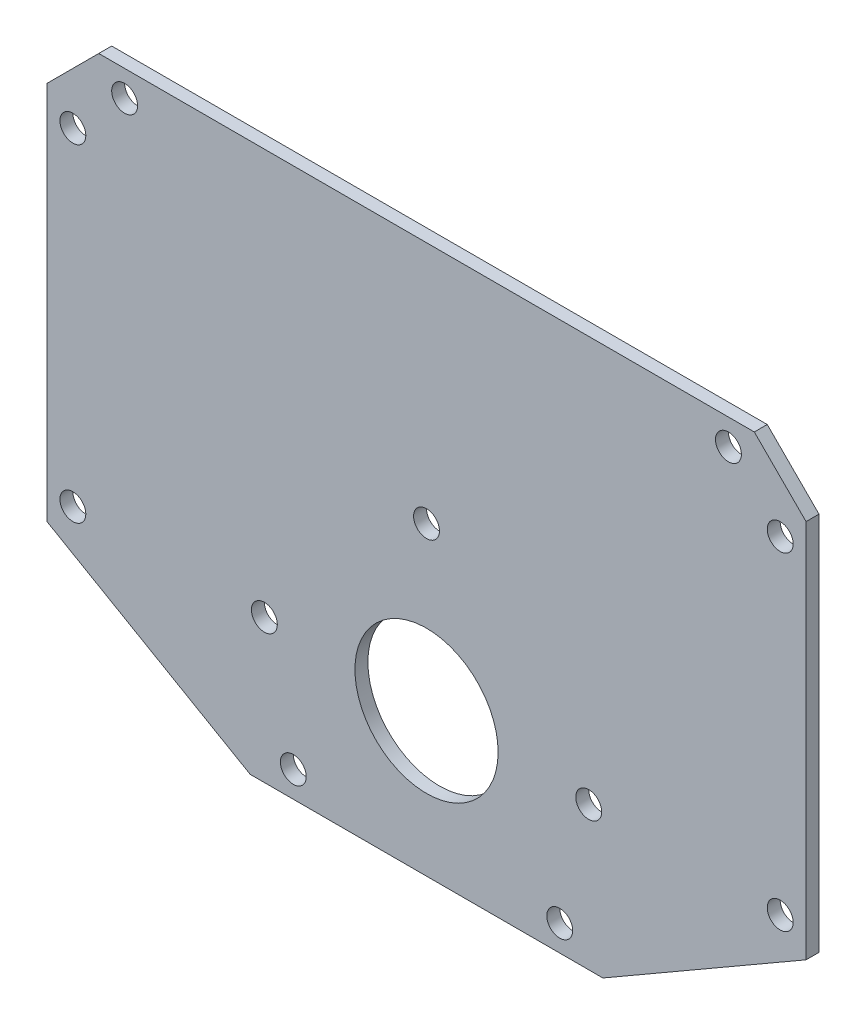
ISO-10303-21;
HEADER;
FILE_DESCRIPTION(('STEP AP214'),'2;1');
FILE_NAME('part.step','',(''),(''),'','','');
FILE_SCHEMA(('AUTOMOTIVE_DESIGN { 1 0 10303 214 1 1 1 1 }'));
ENDSEC;
DATA;
#1=APPLICATION_CONTEXT('core data for automotive mechanical design processes');
#2=APPLICATION_PROTOCOL_DEFINITION('international standard','automotive_design',2000,#1);
#3=PRODUCT_CONTEXT('',#1,'mechanical');
#4=PRODUCT('Part','Part','',(#3));
#5=PRODUCT_RELATED_PRODUCT_CATEGORY('part','',(#4));
#6=PRODUCT_DEFINITION_FORMATION('','',#4);
#7=PRODUCT_DEFINITION_CONTEXT('part definition',#1,'design');
#8=PRODUCT_DEFINITION('design','',#6,#7);
#9=PRODUCT_DEFINITION_SHAPE('','',#8);
#10=(LENGTH_UNIT() NAMED_UNIT(*) SI_UNIT(.MILLI.,.METRE.));
#11=(NAMED_UNIT(*) PLANE_ANGLE_UNIT() SI_UNIT($,.RADIAN.));
#12=(NAMED_UNIT(*) SI_UNIT($,.STERADIAN.) SOLID_ANGLE_UNIT());
#13=UNCERTAINTY_MEASURE_WITH_UNIT(LENGTH_MEASURE(1.E-05),#10,'distance_accuracy_value','');
#14=(GEOMETRIC_REPRESENTATION_CONTEXT(3) GLOBAL_UNCERTAINTY_ASSIGNED_CONTEXT((#13)) GLOBAL_UNIT_ASSIGNED_CONTEXT((#10,
#11,#12)) REPRESENTATION_CONTEXT('',''));
#15=CARTESIAN_POINT('',(0.,0.,0.));
#16=DIRECTION('',(0.,0.,1.));
#17=DIRECTION('',(1.,0.,0.));
#18=AXIS2_PLACEMENT_3D('',#15,#16,#17);
#19=CARTESIAN_POINT('',(0.,0.,1.5));
#20=DIRECTION('',(0.,0.,-1.));
#21=DIRECTION('',(-1.,0.,0.));
#22=AXIS2_PLACEMENT_3D('',#19,#20,#21);
#23=PLANE('',#22);
#24=CARTESIAN_POINT('',(-15.4441090170633,-32.6,1.5));
#25=DIRECTION('',(0.,0.,1.));
#26=DIRECTION('',(1.,0.,0.));
#27=AXIS2_PLACEMENT_3D('',#24,#25,#26);
#28=CIRCLE('',#27,1.5);
#29=CARTESIAN_POINT('',(-13.9441090170633,-32.6,1.5));
#30=VERTEX_POINT('',#29);
#31=EDGE_CURVE('E312',#30,#30,#28,.T.);
#32=ORIENTED_EDGE('',*,*,#31,.F.);
#33=EDGE_LOOP('',(#32));
#34=FACE_BOUND('',#33,.T.);
#35=CARTESIAN_POINT('',(0.,-19.,1.5));
#36=DIRECTION('',(0.,0.,1.));
#37=DIRECTION('',(1.,0.,0.));
#38=AXIS2_PLACEMENT_3D('',#35,#36,#37);
#39=CIRCLE('',#38,8.3);
#40=CARTESIAN_POINT('',(8.3,-19.,1.5));
#41=VERTEX_POINT('',#40);
#42=EDGE_CURVE('E316',#41,#41,#39,.T.);
#43=ORIENTED_EDGE('',*,*,#42,.F.);
#44=EDGE_LOOP('',(#43));
#45=FACE_BOUND('',#44,.T.);
#46=CARTESIAN_POINT('',(18.8,-19.,1.5));
#47=DIRECTION('',(0.,0.,1.));
#48=DIRECTION('',(1.,0.,0.));
#49=AXIS2_PLACEMENT_3D('',#46,#47,#48);
#50=CIRCLE('',#49,1.5);
#51=CARTESIAN_POINT('',(20.3,-19.,1.5));
#52=VERTEX_POINT('',#51);
#53=EDGE_CURVE('E325',#52,#52,#50,.T.);
#54=ORIENTED_EDGE('',*,*,#53,.F.);
#55=EDGE_LOOP('',(#54));
#56=FACE_BOUND('',#55,.T.);
#57=CARTESIAN_POINT('',(-18.8,-19.,1.5));
#58=DIRECTION('',(0.,0.,1.));
#59=DIRECTION('',(1.,0.,0.));
#60=AXIS2_PLACEMENT_3D('',#57,#58,#59);
#61=CIRCLE('',#60,1.5);
#62=CARTESIAN_POINT('',(-17.3,-19.,1.5));
#63=VERTEX_POINT('',#62);
#64=EDGE_CURVE('E327',#63,#63,#61,.T.);
#65=ORIENTED_EDGE('',*,*,#64,.F.);
#66=EDGE_LOOP('',(#65));
#67=FACE_BOUND('',#66,.T.);
#68=CARTESIAN_POINT('',(15.4441090170629,-32.6,1.5));
#69=DIRECTION('',(0.,0.,1.));
#70=DIRECTION('',(1.,0.,0.));
#71=AXIS2_PLACEMENT_3D('',#68,#69,#70);
#72=CIRCLE('',#71,1.5);
#73=CARTESIAN_POINT('',(16.9441090170629,-32.6,1.5));
#74=VERTEX_POINT('',#73);
#75=EDGE_CURVE('E310',#74,#74,#72,.T.);
#76=ORIENTED_EDGE('',*,*,#75,.F.);
#77=EDGE_LOOP('',(#76));
#78=FACE_BOUND('',#77,.T.);
#79=CARTESIAN_POINT('',(34.9999999999999,25.,1.5));
#80=DIRECTION('',(0.,0.,1.));
#81=DIRECTION('',(1.,0.,0.));
#82=AXIS2_PLACEMENT_3D('',#79,#80,#81);
#83=CIRCLE('',#82,1.5);
#84=CARTESIAN_POINT('',(36.4999999999999,25.,1.5));
#85=VERTEX_POINT('',#84);
#86=EDGE_CURVE('E313',#85,#85,#83,.T.);
#87=ORIENTED_EDGE('',*,*,#86,.F.);
#88=EDGE_LOOP('',(#87));
#89=FACE_BOUND('',#88,.T.);
#90=CARTESIAN_POINT('',(-35.,25.,1.5));
#91=DIRECTION('',(0.,0.,1.));
#92=DIRECTION('',(1.,0.,0.));
#93=AXIS2_PLACEMENT_3D('',#90,#91,#92);
#94=CIRCLE('',#93,1.5);
#95=CARTESIAN_POINT('',(-33.5,25.,1.5));
#96=VERTEX_POINT('',#95);
#97=EDGE_CURVE('E319',#96,#96,#94,.T.);
#98=ORIENTED_EDGE('',*,*,#97,.F.);
#99=EDGE_LOOP('',(#98));
#100=FACE_BOUND('',#99,.T.);
#101=CARTESIAN_POINT('',(0.,-0.20000000000003,1.5));
#102=DIRECTION('',(0.,0.,1.));
#103=DIRECTION('',(1.,0.,0.));
#104=AXIS2_PLACEMENT_3D('',#101,#102,#103);
#105=CIRCLE('',#104,1.5);
#106=CARTESIAN_POINT('',(1.5,-0.20000000000003,1.5));
#107=VERTEX_POINT('',#106);
#108=EDGE_CURVE('E170',#107,#107,#105,.T.);
#109=ORIENTED_EDGE('',*,*,#108,.F.);
#110=EDGE_LOOP('',(#109));
#111=FACE_BOUND('',#110,.T.);
#112=DIRECTION('',(0.866025403784442,0.499999999999995,0.));
#113=VECTOR('',#112,1.);
#114=CARTESIAN_POINT('',(44.,-22.,1.5));
#115=LINE('',#114,#113);
#116=CARTESIAN_POINT('',(20.4441090170629,-35.6,1.5));
#117=VERTEX_POINT('',#116);
#118=CARTESIAN_POINT('',(44.,-22.,1.5));
#119=VERTEX_POINT('',#118);
#120=EDGE_CURVE('E154',#117,#119,#115,.T.);
#121=ORIENTED_EDGE('',*,*,#120,.T.);
#122=DIRECTION('',(0.,1.,0.));
#123=VECTOR('',#122,1.);
#124=CARTESIAN_POINT('',(44.,22.,1.5));
#125=LINE('',#124,#123);
#126=CARTESIAN_POINT('',(44.,22.,1.5));
#127=VERTEX_POINT('',#126);
#128=EDGE_CURVE('E102',#119,#127,#125,.T.);
#129=ORIENTED_EDGE('',*,*,#128,.T.);
#130=DIRECTION('',(-0.707106781186552,0.707106781186543,0.));
#131=VECTOR('',#130,1.);
#132=CARTESIAN_POINT('',(44.,22.,1.5));
#133=LINE('',#132,#131);
#134=CARTESIAN_POINT('',(37.9999999999999,28.,1.5));
#135=VERTEX_POINT('',#134);
#136=EDGE_CURVE('E220',#127,#135,#133,.T.);
#137=ORIENTED_EDGE('',*,*,#136,.T.);
#138=DIRECTION('',(-1.,0.,0.));
#139=VECTOR('',#138,1.);
#140=CARTESIAN_POINT('',(-38.,28.,1.5));
#141=LINE('',#140,#139);
#142=CARTESIAN_POINT('',(-38.,28.,1.5));
#143=VERTEX_POINT('',#142);
#144=EDGE_CURVE('E222',#135,#143,#141,.T.);
#145=ORIENTED_EDGE('',*,*,#144,.T.);
#146=DIRECTION('',(-0.707106781186546,-0.707106781186549,0.));
#147=VECTOR('',#146,1.);
#148=CARTESIAN_POINT('',(-44.,22.,1.5));
#149=LINE('',#148,#147);
#150=CARTESIAN_POINT('',(-44.,22.,1.5));
#151=VERTEX_POINT('',#150);
#152=EDGE_CURVE('E121',#143,#151,#149,.T.);
#153=ORIENTED_EDGE('',*,*,#152,.T.);
#154=DIRECTION('',(0.,-1.,0.));
#155=VECTOR('',#154,1.);
#156=CARTESIAN_POINT('',(-44.,22.,1.5));
#157=LINE('',#156,#155);
#158=CARTESIAN_POINT('',(-44.,-22.,1.5));
#159=VERTEX_POINT('',#158);
#160=EDGE_CURVE('E115',#151,#159,#157,.T.);
#161=ORIENTED_EDGE('',*,*,#160,.T.);
#162=DIRECTION('',(0.866025403784438,-0.500000000000001,0.));
#163=VECTOR('',#162,1.);
#164=CARTESIAN_POINT('',(-44.,-22.,1.5));
#165=LINE('',#164,#163);
#166=CARTESIAN_POINT('',(-20.4441090170633,-35.6,1.5));
#167=VERTEX_POINT('',#166);
#168=EDGE_CURVE('E119',#159,#167,#165,.T.);
#169=ORIENTED_EDGE('',*,*,#168,.T.);
#170=DIRECTION('',(1.,0.,0.));
#171=VECTOR('',#170,1.);
#172=CARTESIAN_POINT('',(-20.4441090170633,-35.6,1.5));
#173=LINE('',#172,#171);
#174=EDGE_CURVE('E59',#167,#117,#173,.T.);
#175=ORIENTED_EDGE('',*,*,#174,.T.);
#176=EDGE_LOOP('',(#121,#129,#137,#145,#153,#161,#169,#175));
#177=FACE_BOUND('',#176,.T.);
#178=CARTESIAN_POINT('',(-41.,19.,1.5));
#179=DIRECTION('',(0.,0.,1.));
#180=DIRECTION('',(1.,0.,0.));
#181=AXIS2_PLACEMENT_3D('',#178,#179,#180);
#182=CIRCLE('',#181,1.5);
#183=CARTESIAN_POINT('',(-39.5,19.,1.5));
#184=VERTEX_POINT('',#183);
#185=EDGE_CURVE('E143',#184,#184,#182,.T.);
#186=ORIENTED_EDGE('',*,*,#185,.F.);
#187=EDGE_LOOP('',(#186));
#188=FACE_BOUND('',#187,.T.);
#189=CARTESIAN_POINT('',(-41.,-19.,1.5));
#190=DIRECTION('',(0.,0.,1.));
#191=DIRECTION('',(1.,0.,0.));
#192=AXIS2_PLACEMENT_3D('',#189,#190,#191);
#193=CIRCLE('',#192,1.5);
#194=CARTESIAN_POINT('',(-39.5,-19.,1.5));
#195=VERTEX_POINT('',#194);
#196=EDGE_CURVE('E208',#195,#195,#193,.T.);
#197=ORIENTED_EDGE('',*,*,#196,.F.);
#198=EDGE_LOOP('',(#197));
#199=FACE_BOUND('',#198,.T.);
#200=CARTESIAN_POINT('',(41.,19.,1.5));
#201=DIRECTION('',(0.,0.,1.));
#202=DIRECTION('',(1.,0.,0.));
#203=AXIS2_PLACEMENT_3D('',#200,#201,#202);
#204=CIRCLE('',#203,1.5);
#205=CARTESIAN_POINT('',(42.5,19.,1.5));
#206=VERTEX_POINT('',#205);
#207=EDGE_CURVE('E202',#206,#206,#204,.T.);
#208=ORIENTED_EDGE('',*,*,#207,.F.);
#209=EDGE_LOOP('',(#208));
#210=FACE_BOUND('',#209,.T.);
#211=CARTESIAN_POINT('',(41.,-19.,1.5));
#212=DIRECTION('',(0.,0.,1.));
#213=DIRECTION('',(1.,0.,0.));
#214=AXIS2_PLACEMENT_3D('',#211,#212,#213);
#215=CIRCLE('',#214,1.49999999999999);
#216=CARTESIAN_POINT('',(42.5,-19.,1.5));
#217=VERTEX_POINT('',#216);
#218=EDGE_CURVE('E193',#217,#217,#215,.T.);
#219=ORIENTED_EDGE('',*,*,#218,.F.);
#220=EDGE_LOOP('',(#219));
#221=FACE_BOUND('',#220,.T.);
#222=ADVANCED_FACE('F40',(#34,#45,#56,#67,#78,#89,#100,#111,#177,#188,#199,#210,#221),#23,.F.);
#223=CARTESIAN_POINT('',(0.,0.,0.));
#224=DIRECTION('',(0.,0.,-1.));
#225=DIRECTION('',(-1.,0.,0.));
#226=AXIS2_PLACEMENT_3D('',#223,#224,#225);
#227=PLANE('',#226);
#228=CARTESIAN_POINT('',(-15.4441090170633,-32.6,0.));
#229=DIRECTION('',(0.,0.,-1.));
#230=DIRECTION('',(-1.,0.,0.));
#231=AXIS2_PLACEMENT_3D('',#228,#229,#230);
#232=CIRCLE('',#231,1.5);
#233=CARTESIAN_POINT('',(-16.9441090170633,-32.6,0.));
#234=VERTEX_POINT('',#233);
#235=EDGE_CURVE('E44',#234,#234,#232,.T.);
#236=ORIENTED_EDGE('',*,*,#235,.F.);
#237=EDGE_LOOP('',(#236));
#238=FACE_BOUND('',#237,.T.);
#239=CARTESIAN_POINT('',(0.,-19.,0.));
#240=DIRECTION('',(0.,0.,-1.));
#241=DIRECTION('',(-1.,0.,0.));
#242=AXIS2_PLACEMENT_3D('',#239,#240,#241);
#243=CIRCLE('',#242,8.3);
#244=CARTESIAN_POINT('',(-8.3,-19.,0.));
#245=VERTEX_POINT('',#244);
#246=EDGE_CURVE('E184',#245,#245,#243,.T.);
#247=ORIENTED_EDGE('',*,*,#246,.F.);
#248=EDGE_LOOP('',(#247));
#249=FACE_BOUND('',#248,.T.);
#250=CARTESIAN_POINT('',(18.8,-19.,0.));
#251=DIRECTION('',(0.,0.,-1.));
#252=DIRECTION('',(-1.,0.,0.));
#253=AXIS2_PLACEMENT_3D('',#250,#251,#252);
#254=CIRCLE('',#253,1.5);
#255=CARTESIAN_POINT('',(17.3,-19.,0.));
#256=VERTEX_POINT('',#255);
#257=EDGE_CURVE('E182',#256,#256,#254,.T.);
#258=ORIENTED_EDGE('',*,*,#257,.F.);
#259=EDGE_LOOP('',(#258));
#260=FACE_BOUND('',#259,.T.);
#261=CARTESIAN_POINT('',(-18.8,-19.,0.));
#262=DIRECTION('',(0.,0.,-1.));
#263=DIRECTION('',(-1.,0.,0.));
#264=AXIS2_PLACEMENT_3D('',#261,#262,#263);
#265=CIRCLE('',#264,1.5);
#266=CARTESIAN_POINT('',(-20.3,-19.,0.));
#267=VERTEX_POINT('',#266);
#268=EDGE_CURVE('E179',#267,#267,#265,.T.);
#269=ORIENTED_EDGE('',*,*,#268,.F.);
#270=EDGE_LOOP('',(#269));
#271=FACE_BOUND('',#270,.T.);
#272=CARTESIAN_POINT('',(15.4441090170629,-32.6,0.));
#273=DIRECTION('',(0.,0.,-1.));
#274=DIRECTION('',(-1.,0.,0.));
#275=AXIS2_PLACEMENT_3D('',#272,#273,#274);
#276=CIRCLE('',#275,1.5);
#277=CARTESIAN_POINT('',(13.9441090170629,-32.6,0.));
#278=VERTEX_POINT('',#277);
#279=EDGE_CURVE('E176',#278,#278,#276,.T.);
#280=ORIENTED_EDGE('',*,*,#279,.F.);
#281=EDGE_LOOP('',(#280));
#282=FACE_BOUND('',#281,.T.);
#283=CARTESIAN_POINT('',(34.9999999999999,25.,0.));
#284=DIRECTION('',(0.,0.,-1.));
#285=DIRECTION('',(-1.,0.,0.));
#286=AXIS2_PLACEMENT_3D('',#283,#284,#285);
#287=CIRCLE('',#286,1.5);
#288=CARTESIAN_POINT('',(33.4999999999999,25.,0.));
#289=VERTEX_POINT('',#288);
#290=EDGE_CURVE('E173',#289,#289,#287,.T.);
#291=ORIENTED_EDGE('',*,*,#290,.F.);
#292=EDGE_LOOP('',(#291));
#293=FACE_BOUND('',#292,.T.);
#294=CARTESIAN_POINT('',(-35.,25.,0.));
#295=DIRECTION('',(0.,0.,-1.));
#296=DIRECTION('',(-1.,0.,0.));
#297=AXIS2_PLACEMENT_3D('',#294,#295,#296);
#298=CIRCLE('',#297,1.5);
#299=CARTESIAN_POINT('',(-36.5,25.,0.));
#300=VERTEX_POINT('',#299);
#301=EDGE_CURVE('E169',#300,#300,#298,.T.);
#302=ORIENTED_EDGE('',*,*,#301,.F.);
#303=EDGE_LOOP('',(#302));
#304=FACE_BOUND('',#303,.T.);
#305=CARTESIAN_POINT('',(0.,-0.20000000000003,0.));
#306=DIRECTION('',(0.,0.,-1.));
#307=DIRECTION('',(-1.,0.,0.));
#308=AXIS2_PLACEMENT_3D('',#305,#306,#307);
#309=CIRCLE('',#308,1.5);
#310=CARTESIAN_POINT('',(-1.5,-0.20000000000003,0.));
#311=VERTEX_POINT('',#310);
#312=EDGE_CURVE('E166',#311,#311,#309,.T.);
#313=ORIENTED_EDGE('',*,*,#312,.F.);
#314=EDGE_LOOP('',(#313));
#315=FACE_BOUND('',#314,.T.);
#316=CARTESIAN_POINT('',(41.,19.,0.));
#317=DIRECTION('',(0.,0.,1.));
#318=DIRECTION('',(1.,0.,0.));
#319=AXIS2_PLACEMENT_3D('',#316,#317,#318);
#320=CIRCLE('',#319,1.5);
#321=CARTESIAN_POINT('',(42.5,19.,0.));
#322=VERTEX_POINT('',#321);
#323=EDGE_CURVE('E198',#322,#322,#320,.T.);
#324=ORIENTED_EDGE('',*,*,#323,.T.);
#325=EDGE_LOOP('',(#324));
#326=FACE_BOUND('',#325,.T.);
#327=CARTESIAN_POINT('',(-41.,19.,0.));
#328=DIRECTION('',(0.,0.,1.));
#329=DIRECTION('',(1.,0.,0.));
#330=AXIS2_PLACEMENT_3D('',#327,#328,#329);
#331=CIRCLE('',#330,1.5);
#332=CARTESIAN_POINT('',(-39.5,19.,0.));
#333=VERTEX_POINT('',#332);
#334=EDGE_CURVE('E211',#333,#333,#331,.T.);
#335=ORIENTED_EDGE('',*,*,#334,.T.);
#336=EDGE_LOOP('',(#335));
#337=FACE_BOUND('',#336,.T.);
#338=DIRECTION('',(0.866025403784442,0.499999999999995,0.));
#339=VECTOR('',#338,1.);
#340=CARTESIAN_POINT('',(44.,-22.,0.));
#341=LINE('',#340,#339);
#342=CARTESIAN_POINT('',(20.4441090170629,-35.6,0.));
#343=VERTEX_POINT('',#342);
#344=CARTESIAN_POINT('',(44.,-22.,0.));
#345=VERTEX_POINT('',#344);
#346=EDGE_CURVE('E139',#343,#345,#341,.T.);
#347=ORIENTED_EDGE('',*,*,#346,.F.);
#348=DIRECTION('',(1.,0.,0.));
#349=VECTOR('',#348,1.);
#350=CARTESIAN_POINT('',(-20.4441090170633,-35.6,0.));
#351=LINE('',#350,#349);
#352=CARTESIAN_POINT('',(-20.4441090170633,-35.6,0.));
#353=VERTEX_POINT('',#352);
#354=EDGE_CURVE('E94',#353,#343,#351,.T.);
#355=ORIENTED_EDGE('',*,*,#354,.F.);
#356=DIRECTION('',(0.866025403784438,-0.500000000000001,0.));
#357=VECTOR('',#356,1.);
#358=CARTESIAN_POINT('',(-44.,-22.,0.));
#359=LINE('',#358,#357);
#360=CARTESIAN_POINT('',(-44.,-22.,0.));
#361=VERTEX_POINT('',#360);
#362=EDGE_CURVE('E88',#361,#353,#359,.T.);
#363=ORIENTED_EDGE('',*,*,#362,.F.);
#364=DIRECTION('',(0.,-1.,0.));
#365=VECTOR('',#364,1.);
#366=CARTESIAN_POINT('',(-44.,22.,0.));
#367=LINE('',#366,#365);
#368=CARTESIAN_POINT('',(-44.,22.,0.));
#369=VERTEX_POINT('',#368);
#370=EDGE_CURVE('E129',#369,#361,#367,.T.);
#371=ORIENTED_EDGE('',*,*,#370,.F.);
#372=DIRECTION('',(-0.707106781186546,-0.707106781186549,0.));
#373=VECTOR('',#372,1.);
#374=CARTESIAN_POINT('',(-44.,22.,0.));
#375=LINE('',#374,#373);
#376=CARTESIAN_POINT('',(-38.,28.,0.));
#377=VERTEX_POINT('',#376);
#378=EDGE_CURVE('E149',#377,#369,#375,.T.);
#379=ORIENTED_EDGE('',*,*,#378,.F.);
#380=DIRECTION('',(-1.,0.,0.));
#381=VECTOR('',#380,1.);
#382=CARTESIAN_POINT('',(-38.,28.,0.));
#383=LINE('',#382,#381);
#384=CARTESIAN_POINT('',(37.9999999999999,28.,0.));
#385=VERTEX_POINT('',#384);
#386=EDGE_CURVE('E147',#385,#377,#383,.T.);
#387=ORIENTED_EDGE('',*,*,#386,.F.);
#388=DIRECTION('',(-0.707106781186552,0.707106781186543,0.));
#389=VECTOR('',#388,1.);
#390=CARTESIAN_POINT('',(44.,22.,0.));
#391=LINE('',#390,#389);
#392=CARTESIAN_POINT('',(44.,22.,0.));
#393=VERTEX_POINT('',#392);
#394=EDGE_CURVE('E145',#393,#385,#391,.T.);
#395=ORIENTED_EDGE('',*,*,#394,.F.);
#396=DIRECTION('',(0.,1.,0.));
#397=VECTOR('',#396,1.);
#398=CARTESIAN_POINT('',(44.,22.,0.));
#399=LINE('',#398,#397);
#400=EDGE_CURVE('E142',#345,#393,#399,.T.);
#401=ORIENTED_EDGE('',*,*,#400,.F.);
#402=EDGE_LOOP('',(#347,#355,#363,#371,#379,#387,#395,#401));
#403=FACE_BOUND('',#402,.T.);
#404=CARTESIAN_POINT('',(-41.,-19.,0.));
#405=DIRECTION('',(0.,0.,1.));
#406=DIRECTION('',(1.,0.,0.));
#407=AXIS2_PLACEMENT_3D('',#404,#405,#406);
#408=CIRCLE('',#407,1.5);
#409=CARTESIAN_POINT('',(-39.5,-19.,0.));
#410=VERTEX_POINT('',#409);
#411=EDGE_CURVE('E205',#410,#410,#408,.T.);
#412=ORIENTED_EDGE('',*,*,#411,.T.);
#413=EDGE_LOOP('',(#412));
#414=FACE_BOUND('',#413,.T.);
#415=CARTESIAN_POINT('',(41.,-19.,0.));
#416=DIRECTION('',(0.,0.,1.));
#417=DIRECTION('',(1.,0.,0.));
#418=AXIS2_PLACEMENT_3D('',#415,#416,#417);
#419=CIRCLE('',#418,1.49999999999999);
#420=CARTESIAN_POINT('',(42.5,-19.,0.));
#421=VERTEX_POINT('',#420);
#422=EDGE_CURVE('E189',#421,#421,#419,.T.);
#423=ORIENTED_EDGE('',*,*,#422,.T.);
#424=EDGE_LOOP('',(#423));
#425=FACE_BOUND('',#424,.T.);
#426=ADVANCED_FACE('F235',(#238,#249,#260,#271,#282,#293,#304,#315,#326,#337,#403,#414,#425),
#227,.T.);
#427=CARTESIAN_POINT('',(44.,-22.,1.5));
#428=DIRECTION('',(-0.499999999999995,0.866025403784441,0.));
#429=DIRECTION('',(-0.866025403784442,-0.499999999999995,0.));
#430=AXIS2_PLACEMENT_3D('',#427,#428,#429);
#431=PLANE('',#430);
#432=ORIENTED_EDGE('',*,*,#346,.T.);
#433=DIRECTION('',(0.,0.,-1.));
#434=VECTOR('',#433,1.);
#435=CARTESIAN_POINT('',(44.,-22.,1.5));
#436=LINE('',#435,#434);
#437=EDGE_CURVE('E11',#119,#345,#436,.T.);
#438=ORIENTED_EDGE('',*,*,#437,.F.);
#439=ORIENTED_EDGE('',*,*,#120,.F.);
#440=DIRECTION('',(0.,0.,-1.));
#441=VECTOR('',#440,1.);
#442=CARTESIAN_POINT('',(20.4441090170629,-35.6,1.5));
#443=LINE('',#442,#441);
#444=EDGE_CURVE('E135',#117,#343,#443,.T.);
#445=ORIENTED_EDGE('',*,*,#444,.T.);
#446=EDGE_LOOP('',(#432,#438,#439,#445));
#447=FACE_BOUND('',#446,.T.);
#448=ADVANCED_FACE('F42',(#447),#431,.F.);
#449=CARTESIAN_POINT('',(44.,22.,1.5));
#450=DIRECTION('',(-1.,0.,0.));
#451=DIRECTION('',(0.,0.,1.));
#452=AXIS2_PLACEMENT_3D('',#449,#450,#451);
#453=PLANE('',#452);
#454=ORIENTED_EDGE('',*,*,#400,.T.);
#455=DIRECTION('',(0.,0.,-1.));
#456=VECTOR('',#455,1.);
#457=CARTESIAN_POINT('',(44.,22.,1.5));
#458=LINE('',#457,#456);
#459=EDGE_CURVE('E50',#127,#393,#458,.T.);
#460=ORIENTED_EDGE('',*,*,#459,.F.);
#461=ORIENTED_EDGE('',*,*,#128,.F.);
#462=ORIENTED_EDGE('',*,*,#437,.T.);
#463=EDGE_LOOP('',(#454,#460,#461,#462));
#464=FACE_BOUND('',#463,.T.);
#465=ADVANCED_FACE('F463',(#464),#453,.F.);
#466=CARTESIAN_POINT('',(44.,22.,1.5));
#467=DIRECTION('',(-0.707106781186543,-0.707106781186552,0.));
#468=DIRECTION('',(0.707106781186552,-0.707106781186543,0.));
#469=AXIS2_PLACEMENT_3D('',#466,#467,#468);
#470=PLANE('',#469);
#471=ORIENTED_EDGE('',*,*,#394,.T.);
#472=DIRECTION('',(0.,0.,-1.));
#473=VECTOR('',#472,1.);
#474=CARTESIAN_POINT('',(37.9999999999999,28.,1.5));
#475=LINE('',#474,#473);
#476=EDGE_CURVE('E161',#135,#385,#475,.T.);
#477=ORIENTED_EDGE('',*,*,#476,.F.);
#478=ORIENTED_EDGE('',*,*,#136,.F.);
#479=ORIENTED_EDGE('',*,*,#459,.T.);
#480=EDGE_LOOP('',(#471,#477,#478,#479));
#481=FACE_BOUND('',#480,.T.);
#482=ADVANCED_FACE('F455',(#481),#470,.F.);
#483=CARTESIAN_POINT('',(-38.,28.,1.5));
#484=DIRECTION('',(0.,-1.,0.));
#485=DIRECTION('',(0.,0.,-1.));
#486=AXIS2_PLACEMENT_3D('',#483,#484,#485);
#487=PLANE('',#486);
#488=ORIENTED_EDGE('',*,*,#386,.T.);
#489=DIRECTION('',(0.,0.,-1.));
#490=VECTOR('',#489,1.);
#491=CARTESIAN_POINT('',(-38.,28.,1.5));
#492=LINE('',#491,#490);
#493=EDGE_CURVE('E158',#143,#377,#492,.T.);
#494=ORIENTED_EDGE('',*,*,#493,.F.);
#495=ORIENTED_EDGE('',*,*,#144,.F.);
#496=ORIENTED_EDGE('',*,*,#476,.T.);
#497=EDGE_LOOP('',(#488,#494,#495,#496));
#498=FACE_BOUND('',#497,.T.);
#499=ADVANCED_FACE('F228',(#498),#487,.F.);
#500=CARTESIAN_POINT('',(-44.,22.,1.5));
#501=DIRECTION('',(0.707106781186549,-0.707106781186546,0.));
#502=DIRECTION('',(0.707106781186546,0.707106781186549,0.));
#503=AXIS2_PLACEMENT_3D('',#500,#501,#502);
#504=PLANE('',#503);
#505=ORIENTED_EDGE('',*,*,#378,.T.);
#506=DIRECTION('',(0.,0.,-1.));
#507=VECTOR('',#506,1.);
#508=CARTESIAN_POINT('',(-44.,22.,1.5));
#509=LINE('',#508,#507);
#510=EDGE_CURVE('E130',#151,#369,#509,.T.);
#511=ORIENTED_EDGE('',*,*,#510,.F.);
#512=ORIENTED_EDGE('',*,*,#152,.F.);
#513=ORIENTED_EDGE('',*,*,#493,.T.);
#514=EDGE_LOOP('',(#505,#511,#512,#513));
#515=FACE_BOUND('',#514,.T.);
#516=ADVANCED_FACE('F232',(#515),#504,.F.);
#517=CARTESIAN_POINT('',(-44.,22.,1.5));
#518=DIRECTION('',(1.,0.,0.));
#519=DIRECTION('',(0.,0.,-1.));
#520=AXIS2_PLACEMENT_3D('',#517,#518,#519);
#521=PLANE('',#520);
#522=ORIENTED_EDGE('',*,*,#370,.T.);
#523=DIRECTION('',(0.,0.,-1.));
#524=VECTOR('',#523,1.);
#525=CARTESIAN_POINT('',(-44.,-22.,1.5));
#526=LINE('',#525,#524);
#527=EDGE_CURVE('E126',#159,#361,#526,.T.);
#528=ORIENTED_EDGE('',*,*,#527,.F.);
#529=ORIENTED_EDGE('',*,*,#160,.F.);
#530=ORIENTED_EDGE('',*,*,#510,.T.);
#531=EDGE_LOOP('',(#522,#528,#529,#530));
#532=FACE_BOUND('',#531,.T.);
#533=ADVANCED_FACE('F127',(#532),#521,.F.);
#534=CARTESIAN_POINT('',(-44.,-22.,1.5));
#535=DIRECTION('',(0.500000000000001,0.866025403784438,0.));
#536=DIRECTION('',(-0.866025403784438,0.500000000000001,0.));
#537=AXIS2_PLACEMENT_3D('',#534,#535,#536);
#538=PLANE('',#537);
#539=ORIENTED_EDGE('',*,*,#362,.T.);
#540=DIRECTION('',(0.,0.,-1.));
#541=VECTOR('',#540,1.);
#542=CARTESIAN_POINT('',(-20.4441090170633,-35.6,1.5));
#543=LINE('',#542,#541);
#544=EDGE_CURVE('E131',#167,#353,#543,.T.);
#545=ORIENTED_EDGE('',*,*,#544,.F.);
#546=ORIENTED_EDGE('',*,*,#168,.F.);
#547=ORIENTED_EDGE('',*,*,#527,.T.);
#548=EDGE_LOOP('',(#539,#545,#546,#547));
#549=FACE_BOUND('',#548,.T.);
#550=ADVANCED_FACE('F133',(#549),#538,.F.);
#551=CARTESIAN_POINT('',(-20.4441090170633,-35.6,1.5));
#552=DIRECTION('',(0.,1.,0.));
#553=DIRECTION('',(0.,0.,1.));
#554=AXIS2_PLACEMENT_3D('',#551,#552,#553);
#555=PLANE('',#554);
#556=ORIENTED_EDGE('',*,*,#354,.T.);
#557=ORIENTED_EDGE('',*,*,#444,.F.);
#558=ORIENTED_EDGE('',*,*,#174,.F.);
#559=ORIENTED_EDGE('',*,*,#544,.T.);
#560=EDGE_LOOP('',(#556,#557,#558,#559));
#561=FACE_BOUND('',#560,.T.);
#562=ADVANCED_FACE('F241',(#561),#555,.F.);
#563=CARTESIAN_POINT('',(-41.,19.,1.5));
#564=DIRECTION('',(0.,0.,-1.));
#565=DIRECTION('',(-1.,0.,0.));
#566=AXIS2_PLACEMENT_3D('',#563,#564,#565);
#567=CYLINDRICAL_SURFACE('',#566,1.5);
#568=ORIENTED_EDGE('',*,*,#185,.T.);
#569=EDGE_LOOP('',(#568));
#570=FACE_BOUND('',#569,.T.);
#571=ORIENTED_EDGE('',*,*,#334,.F.);
#572=EDGE_LOOP('',(#571));
#573=FACE_BOUND('',#572,.T.);
#574=ADVANCED_FACE('F243',(#570,#573),#567,.F.);
#575=CARTESIAN_POINT('',(-41.,-19.,1.5));
#576=DIRECTION('',(0.,0.,-1.));
#577=DIRECTION('',(-1.,0.,0.));
#578=AXIS2_PLACEMENT_3D('',#575,#576,#577);
#579=CYLINDRICAL_SURFACE('',#578,1.5);
#580=ORIENTED_EDGE('',*,*,#196,.T.);
#581=EDGE_LOOP('',(#580));
#582=FACE_BOUND('',#581,.T.);
#583=ORIENTED_EDGE('',*,*,#411,.F.);
#584=EDGE_LOOP('',(#583));
#585=FACE_BOUND('',#584,.T.);
#586=ADVANCED_FACE('F249',(#582,#585),#579,.F.);
#587=CARTESIAN_POINT('',(41.,19.,1.5));
#588=DIRECTION('',(0.,0.,-1.));
#589=DIRECTION('',(-1.,0.,0.));
#590=AXIS2_PLACEMENT_3D('',#587,#588,#589);
#591=CYLINDRICAL_SURFACE('',#590,1.5);
#592=ORIENTED_EDGE('',*,*,#207,.T.);
#593=EDGE_LOOP('',(#592));
#594=FACE_BOUND('',#593,.T.);
#595=ORIENTED_EDGE('',*,*,#323,.F.);
#596=EDGE_LOOP('',(#595));
#597=FACE_BOUND('',#596,.T.);
#598=ADVANCED_FACE('F267',(#594,#597),#591,.F.);
#599=CARTESIAN_POINT('',(41.,-19.,1.5));
#600=DIRECTION('',(0.,0.,-1.));
#601=DIRECTION('',(-1.,0.,0.));
#602=AXIS2_PLACEMENT_3D('',#599,#600,#601);
#603=CYLINDRICAL_SURFACE('',#602,1.49999999999999);
#604=ORIENTED_EDGE('',*,*,#218,.T.);
#605=EDGE_LOOP('',(#604));
#606=FACE_BOUND('',#605,.T.);
#607=ORIENTED_EDGE('',*,*,#422,.F.);
#608=EDGE_LOOP('',(#607));
#609=FACE_BOUND('',#608,.T.);
#610=ADVANCED_FACE('F271',(#606,#609),#603,.F.);
#611=CARTESIAN_POINT('',(0.,-0.20000000000003,-8.5));
#612=DIRECTION('',(0.,0.,1.));
#613=DIRECTION('',(1.,0.,0.));
#614=AXIS2_PLACEMENT_3D('',#611,#612,#613);
#615=CYLINDRICAL_SURFACE('',#614,1.5);
#616=ORIENTED_EDGE('',*,*,#312,.T.);
#617=EDGE_LOOP('',(#616));
#618=FACE_BOUND('',#617,.T.);
#619=ORIENTED_EDGE('',*,*,#108,.T.);
#620=EDGE_LOOP('',(#619));
#621=FACE_BOUND('',#620,.T.);
#622=ADVANCED_FACE('F274',(#618,#621),#615,.F.);
#623=CARTESIAN_POINT('',(-35.,25.,-8.5));
#624=DIRECTION('',(0.,0.,1.));
#625=DIRECTION('',(1.,0.,0.));
#626=AXIS2_PLACEMENT_3D('',#623,#624,#625);
#627=CYLINDRICAL_SURFACE('',#626,1.5);
#628=ORIENTED_EDGE('',*,*,#301,.T.);
#629=EDGE_LOOP('',(#628));
#630=FACE_BOUND('',#629,.T.);
#631=ORIENTED_EDGE('',*,*,#97,.T.);
#632=EDGE_LOOP('',(#631));
#633=FACE_BOUND('',#632,.T.);
#634=ADVANCED_FACE('F278',(#630,#633),#627,.F.);
#635=CARTESIAN_POINT('',(34.9999999999999,25.,-8.5));
#636=DIRECTION('',(0.,0.,1.));
#637=DIRECTION('',(1.,0.,0.));
#638=AXIS2_PLACEMENT_3D('',#635,#636,#637);
#639=CYLINDRICAL_SURFACE('',#638,1.5);
#640=ORIENTED_EDGE('',*,*,#290,.T.);
#641=EDGE_LOOP('',(#640));
#642=FACE_BOUND('',#641,.T.);
#643=ORIENTED_EDGE('',*,*,#86,.T.);
#644=EDGE_LOOP('',(#643));
#645=FACE_BOUND('',#644,.T.);
#646=ADVANCED_FACE('F297',(#642,#645),#639,.F.);
#647=CARTESIAN_POINT('',(15.4441090170629,-32.6,-8.5));
#648=DIRECTION('',(0.,0.,1.));
#649=DIRECTION('',(1.,0.,0.));
#650=AXIS2_PLACEMENT_3D('',#647,#648,#649);
#651=CYLINDRICAL_SURFACE('',#650,1.5);
#652=ORIENTED_EDGE('',*,*,#279,.T.);
#653=EDGE_LOOP('',(#652));
#654=FACE_BOUND('',#653,.T.);
#655=ORIENTED_EDGE('',*,*,#75,.T.);
#656=EDGE_LOOP('',(#655));
#657=FACE_BOUND('',#656,.T.);
#658=ADVANCED_FACE('F288',(#654,#657),#651,.F.);
#659=CARTESIAN_POINT('',(-18.8,-19.,-8.5));
#660=DIRECTION('',(0.,0.,1.));
#661=DIRECTION('',(1.,0.,0.));
#662=AXIS2_PLACEMENT_3D('',#659,#660,#661);
#663=CYLINDRICAL_SURFACE('',#662,1.5);
#664=ORIENTED_EDGE('',*,*,#268,.T.);
#665=EDGE_LOOP('',(#664));
#666=FACE_BOUND('',#665,.T.);
#667=ORIENTED_EDGE('',*,*,#64,.T.);
#668=EDGE_LOOP('',(#667));
#669=FACE_BOUND('',#668,.T.);
#670=ADVANCED_FACE('F284',(#666,#669),#663,.F.);
#671=CARTESIAN_POINT('',(18.8,-19.,-8.5));
#672=DIRECTION('',(0.,0.,1.));
#673=DIRECTION('',(1.,0.,0.));
#674=AXIS2_PLACEMENT_3D('',#671,#672,#673);
#675=CYLINDRICAL_SURFACE('',#674,1.5);
#676=ORIENTED_EDGE('',*,*,#257,.T.);
#677=EDGE_LOOP('',(#676));
#678=FACE_BOUND('',#677,.T.);
#679=ORIENTED_EDGE('',*,*,#53,.T.);
#680=EDGE_LOOP('',(#679));
#681=FACE_BOUND('',#680,.T.);
#682=ADVANCED_FACE('F280',(#678,#681),#675,.F.);
#683=CARTESIAN_POINT('',(0.,-19.,-8.5));
#684=DIRECTION('',(0.,0.,1.));
#685=DIRECTION('',(1.,0.,0.));
#686=AXIS2_PLACEMENT_3D('',#683,#684,#685);
#687=CYLINDRICAL_SURFACE('',#686,8.3);
#688=ORIENTED_EDGE('',*,*,#246,.T.);
#689=EDGE_LOOP('',(#688));
#690=FACE_BOUND('',#689,.T.);
#691=ORIENTED_EDGE('',*,*,#42,.T.);
#692=EDGE_LOOP('',(#691));
#693=FACE_BOUND('',#692,.T.);
#694=ADVANCED_FACE('F283',(#690,#693),#687,.F.);
#695=CARTESIAN_POINT('',(-15.4441090170633,-32.6,-8.5));
#696=DIRECTION('',(0.,0.,1.));
#697=DIRECTION('',(1.,0.,0.));
#698=AXIS2_PLACEMENT_3D('',#695,#696,#697);
#699=CYLINDRICAL_SURFACE('',#698,1.5);
#700=ORIENTED_EDGE('',*,*,#235,.T.);
#701=EDGE_LOOP('',(#700));
#702=FACE_BOUND('',#701,.T.);
#703=ORIENTED_EDGE('',*,*,#31,.T.);
#704=EDGE_LOOP('',(#703));
#705=FACE_BOUND('',#704,.T.);
#706=ADVANCED_FACE('F290',(#702,#705),#699,.F.);
#707=CLOSED_SHELL('',(#222,#426,#448,#465,#482,#499,#516,#533,#550,#562,#574,#586,#598,#610,
#622,#634,#646,#658,#670,#682,#694,#706));
#708=MANIFOLD_SOLID_BREP('B2',#707);
#709=ADVANCED_BREP_SHAPE_REPRESENTATION('',(#18,#708),#14);
#710=SHAPE_DEFINITION_REPRESENTATION(#9,#709);
ENDSEC;
END-ISO-10303-21;
